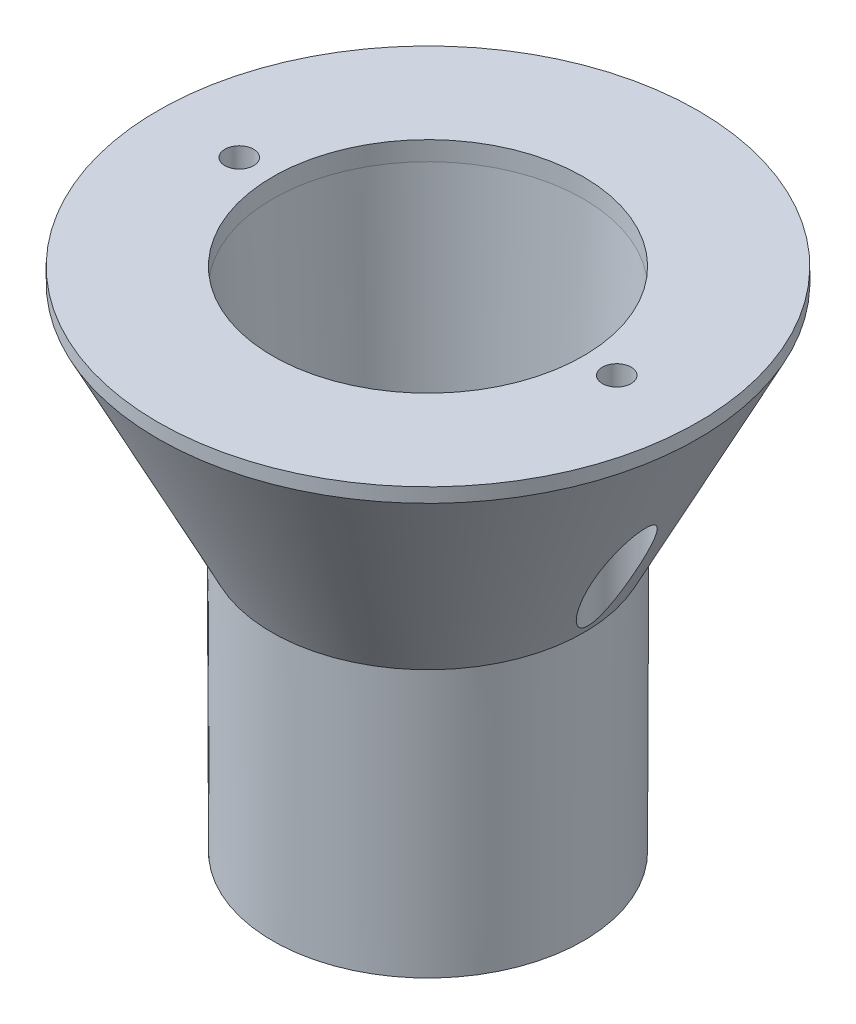
ISO-10303-21;
HEADER;
FILE_DESCRIPTION(('STEP AP214'),'2;1');
FILE_NAME('part.step','',(''),(''),'','','');
FILE_SCHEMA(('AUTOMOTIVE_DESIGN { 1 0 10303 214 1 1 1 1 }'));
ENDSEC;
DATA;
#1=APPLICATION_CONTEXT('core data for automotive mechanical design processes');
#2=APPLICATION_PROTOCOL_DEFINITION('international standard','automotive_design',2000,#1);
#3=PRODUCT_CONTEXT('',#1,'mechanical');
#4=PRODUCT('Part','Part','',(#3));
#5=PRODUCT_RELATED_PRODUCT_CATEGORY('part','',(#4));
#6=PRODUCT_DEFINITION_FORMATION('','',#4);
#7=PRODUCT_DEFINITION_CONTEXT('part definition',#1,'design');
#8=PRODUCT_DEFINITION('design','',#6,#7);
#9=PRODUCT_DEFINITION_SHAPE('','',#8);
#10=(LENGTH_UNIT() NAMED_UNIT(*) SI_UNIT(.MILLI.,.METRE.));
#11=(NAMED_UNIT(*) PLANE_ANGLE_UNIT() SI_UNIT($,.RADIAN.));
#12=(NAMED_UNIT(*) SI_UNIT($,.STERADIAN.) SOLID_ANGLE_UNIT());
#13=UNCERTAINTY_MEASURE_WITH_UNIT(LENGTH_MEASURE(1.E-05),#10,'distance_accuracy_value','');
#14=(GEOMETRIC_REPRESENTATION_CONTEXT(3) GLOBAL_UNCERTAINTY_ASSIGNED_CONTEXT((#13)) GLOBAL_UNIT_ASSIGNED_CONTEXT((#10,
#11,#12)) REPRESENTATION_CONTEXT('',''));
#15=CARTESIAN_POINT('',(0.,0.,0.));
#16=DIRECTION('',(0.,0.,1.));
#17=DIRECTION('',(1.,0.,0.));
#18=AXIS2_PLACEMENT_3D('',#15,#16,#17);
#19=CARTESIAN_POINT('',(0.,56.,0.));
#20=DIRECTION('',(0.,1.,0.));
#21=DIRECTION('',(0.,0.,1.));
#22=AXIS2_PLACEMENT_3D('',#19,#20,#21);
#23=CONICAL_SURFACE('',#22,32.6792977828704,0.469091457883603);
#24=CARTESIAN_POINT('',(0.,56.,0.));
#25=DIRECTION('',(0.,-1.,0.));
#26=DIRECTION('',(0.,0.,-1.));
#27=AXIS2_PLACEMENT_3D('',#24,#25,#26);
#28=CIRCLE('',#27,32.6792977828704);
#29=CARTESIAN_POINT('',(0.,56.,-32.6792977828704));
#30=VERTEX_POINT('',#29);
#31=EDGE_CURVE('E106',#30,#30,#28,.T.);
#32=ORIENTED_EDGE('',*,*,#31,.F.);
#33=EDGE_LOOP('',(#32));
#34=FACE_BOUND('',#33,.T.);
#35=CARTESIAN_POINT('',(0.,103.,0.));
#36=DIRECTION('',(0.,-1.,0.));
#37=DIRECTION('',(0.,0.,-1.));
#38=AXIS2_PLACEMENT_3D('',#35,#36,#37);
#39=CIRCLE('',#38,56.5);
#40=CARTESIAN_POINT('',(0.,103.,-56.5));
#41=VERTEX_POINT('',#40);
#42=EDGE_CURVE('E110',#41,#41,#39,.T.);
#43=ORIENTED_EDGE('',*,*,#42,.T.);
#44=EDGE_LOOP('',(#43));
#45=FACE_BOUND('',#44,.T.);
#46=CARTESIAN_POINT('',(34.1734496423926,59.1679183107118,-2.76185830376439));
#47=CARTESIAN_POINT('',(34.2240932588127,59.2830414120235,-2.85953173416801));
#48=CARTESIAN_POINT('',(34.2760816398383,59.4009266020086,-2.95324120522817));
#49=CARTESIAN_POINT('',(34.3822580395693,59.641033943921,-3.1336349898897));
#50=CARTESIAN_POINT('',(34.4364467859739,59.7632575289212,-3.22031695049874));
#51=CARTESIAN_POINT('',(34.546712080419,60.0112755485579,-3.3874734305346));
#52=CARTESIAN_POINT('',(34.6027907905906,60.137074045221,-3.4679404681241));
#53=CARTESIAN_POINT('',(34.7165093477716,60.3914567340945,-3.62318427952235));
#54=CARTESIAN_POINT('',(34.7741494378359,60.5200413593816,-3.69796016042516));
#55=CARTESIAN_POINT('',(34.9497021614597,60.9105523345077,-3.91531423815694));
#56=CARTESIAN_POINT('',(35.0696686990702,61.1759335393563,-4.05006023881596));
#57=CARTESIAN_POINT('',(35.3137641389315,61.7127478064651,-4.30187189883405));
#58=CARTESIAN_POINT('',(35.4378906694022,61.9841773916821,-4.41894743012312));
#59=CARTESIAN_POINT('',(35.6922196896456,62.5370638625621,-4.64001764337247));
#60=CARTESIAN_POINT('',(35.8224943764523,62.8186124428977,-4.74369842887699));
#61=CARTESIAN_POINT('',(36.0861982566153,63.3851200677914,-4.93686766176311));
#62=CARTESIAN_POINT('',(36.2196280672289,63.6700797742149,-5.026353305216));
#63=CARTESIAN_POINT('',(36.4893587970105,64.2426993151563,-5.1924114798588));
#64=CARTESIAN_POINT('',(36.6256621135614,64.5303612835268,-5.26897270637688));
#65=CARTESIAN_POINT('',(36.9007456307136,65.1074714879367,-5.40996861848303));
#66=CARTESIAN_POINT('',(37.0395259430762,65.3969198041881,-5.47440275537808));
#67=CARTESIAN_POINT('',(37.3194208553526,65.9772510103609,-5.59179013947667));
#68=CARTESIAN_POINT('',(37.4605369465202,66.268134726431,-5.64473572164685));
#69=CARTESIAN_POINT('',(37.744820091369,66.8507114165739,-5.73949393126588));
#70=CARTESIAN_POINT('',(37.8879871682162,67.1424043997571,-5.78130643286203));
#71=CARTESIAN_POINT('',(38.1761236931264,67.726072564722,-5.8540085595437));
#72=CARTESIAN_POINT('',(38.3210921892494,68.0180475280526,-5.8849037192482));
#73=CARTESIAN_POINT('',(38.6127379142719,68.6020865493654,-5.93588060155616));
#74=CARTESIAN_POINT('',(38.7594151464887,68.8941506075194,-5.95596230316239));
#75=CARTESIAN_POINT('',(39.0693074508934,69.5077294782676,-5.98674831390028));
#76=CARTESIAN_POINT('',(39.2326878801016,69.8292198293786,-5.99629177130556));
#77=CARTESIAN_POINT('',(39.5610972616413,70.4714880648432,-6.00193624087375));
#78=CARTESIAN_POINT('',(39.7261262525605,70.792265932304,-5.99803693764435));
#79=CARTESIAN_POINT('',(40.0577126401319,71.4329084573555,-5.97633555589808));
#80=CARTESIAN_POINT('',(40.2242712002849,71.7527721260483,-5.95852184527054));
#81=CARTESIAN_POINT('',(40.5584758675941,72.3907832151539,-5.90831483902926));
#82=CARTESIAN_POINT('',(40.726121943659,72.7089306841594,-5.87592195842769));
#83=CARTESIAN_POINT('',(41.0620008956688,73.342631743249,-5.79568337445215));
#84=CARTESIAN_POINT('',(41.2302331624871,73.6581872827787,-5.74785063721191));
#85=CARTESIAN_POINT('',(41.5669829248043,74.2862394444796,-5.63552100693516));
#86=CARTESIAN_POINT('',(41.7355004505818,74.5987357144826,-5.57102221826052));
#87=CARTESIAN_POINT('',(42.0719440352812,75.2191661427094,-5.42390741154021));
#88=CARTESIAN_POINT('',(42.2398706014806,75.5271064095009,-5.34131855553817));
#89=CARTESIAN_POINT('',(42.5745070696976,76.137447321724,-5.15596739341774));
#90=CARTESIAN_POINT('',(42.7412173741426,76.4398498545752,-5.05321210597725));
#91=CARTESIAN_POINT('',(43.0590657163501,77.0134062012582,-4.83397194569155));
#92=CARTESIAN_POINT('',(43.210383101018,77.2851253258676,-4.71924168260844));
#93=CARTESIAN_POINT('',(43.5097888267326,77.8202897711501,-4.46764818570193));
#94=CARTESIAN_POINT('',(43.6578752717393,78.08373027152,-4.33077233247022));
#95=CARTESIAN_POINT('',(43.947697123246,78.5970563454536,-4.03248812068441));
#96=CARTESIAN_POINT('',(44.0894719944825,78.8470291388389,-3.87127249853491));
#97=CARTESIAN_POINT('',(44.2957296492254,79.2092337198444,-3.6074041646605));
#98=CARTESIAN_POINT('',(44.363377536478,79.3277780257892,-3.51583313750674));
#99=CARTESIAN_POINT('',(44.496010491554,79.5597495401334,-3.32466886919148));
#100=CARTESIAN_POINT('',(44.5609965874268,79.6731787258607,-3.22507877012259));
#101=CARTESIAN_POINT('',(44.6680681929169,79.8597238420549,-3.04928576194942));
#102=CARTESIAN_POINT('',(44.711030840345,79.9344762346683,-2.97535235911406));
#103=CARTESIAN_POINT('',(44.7950537746641,80.0804942709334,-2.82311175338972));
#104=CARTESIAN_POINT('',(44.8361142140167,80.1517601940505,-2.74480490214503));
#105=CARTESIAN_POINT('',(44.9560390948315,80.3596673688453,-2.50282329546686));
#106=CARTESIAN_POINT('',(45.0315861913056,80.4903119848503,-2.33218542827915));
#107=CARTESIAN_POINT('',(45.1709972911084,80.7309470815283,-1.96922418584369));
#108=CARTESIAN_POINT('',(45.2347326311537,80.8407104132461,-1.77669512391471));
#109=CARTESIAN_POINT('',(45.3171141436117,80.9823909179104,-1.47381228809234));
#110=CARTESIAN_POINT('',(45.3423619976997,81.0257748166977,-1.37055675419671));
#111=CARTESIAN_POINT('',(45.3878318722238,81.103860745006,-1.15976966138343));
#112=CARTESIAN_POINT('',(45.4080556815771,81.1385658648188,-1.0522396403532));
#113=CARTESIAN_POINT('',(45.451932548179,81.2138296056048,-0.776408089294423));
#114=CARTESIAN_POINT('',(45.4718681508209,81.2479925625004,-0.605674893786222));
#115=CARTESIAN_POINT('',(45.4968628097814,81.290818659367,-0.260049792145964));
#116=CARTESIAN_POINT('',(45.5019323632831,81.299499792514,-0.0851609084308743));
#117=CARTESIAN_POINT('',(45.4967381074727,81.290602437304,0.263786023962667));
#118=CARTESIAN_POINT('',(45.4864681185147,81.2730133658051,0.437843709444193));
#119=CARTESIAN_POINT('',(45.4515569494015,81.2131786880742,0.780170090372294));
#120=CARTESIAN_POINT('',(45.4269047621219,81.1709141969909,0.948434247290684));
#121=CARTESIAN_POINT('',(45.3565285778207,81.0501275008486,1.32156071299554));
#122=CARTESIAN_POINT('',(45.3068316794702,80.9647570975946,1.5234345567045));
#123=CARTESIAN_POINT('',(45.1919013165517,80.7669453438762,1.90864066589916));
#124=CARTESIAN_POINT('',(45.1266373670203,80.6544508715816,2.09193553177921));
#125=CARTESIAN_POINT('',(45.0012249585994,80.4377897558674,2.3994517269744));
#126=CARTESIAN_POINT('',(44.9433641118133,80.3376790872041,2.52755177534445));
#127=CARTESIAN_POINT('',(44.8224136129272,80.128021076267,2.77320571692549));
#128=CARTESIAN_POINT('',(44.7593210189929,80.0184684233426,2.89075359818089));
#129=CARTESIAN_POINT('',(44.629007756502,79.7917434713867,3.11612789757386));
#130=CARTESIAN_POINT('',(44.5617808370199,79.6745596177179,3.22393895480164));
#131=CARTESIAN_POINT('',(44.4241554675018,79.4341588240777,3.43046380687181));
#132=CARTESIAN_POINT('',(44.353755827938,79.3109396197812,3.52917414667662));
#133=CARTESIAN_POINT('',(44.1513801457873,78.9559442254439,3.79626493337719));
#134=CARTESIAN_POINT('',(44.0165227009459,78.7184804529799,3.95493272981366));
#135=CARTESIAN_POINT('',(43.7415251578796,78.2321616369176,4.24851762035491));
#136=CARTESIAN_POINT('',(43.6013807692332,77.9832973049302,4.38341489813519));
#137=CARTESIAN_POINT('',(43.317454712078,77.4768475406289,4.63279520811406));
#138=CARTESIAN_POINT('',(43.1736663114077,77.2192456159198,4.74723674838517));
#139=CARTESIAN_POINT('',(42.8840391960473,76.6979603944611,4.95785433709485));
#140=CARTESIAN_POINT('',(42.7382009441589,76.4342784620703,5.05403443953239));
#141=CARTESIAN_POINT('',(42.4506547720288,75.9119063751729,5.2269239084802));
#142=CARTESIAN_POINT('',(42.3089894901036,75.6533833460025,5.30421409876563));
#143=CARTESIAN_POINT('',(42.025102410502,75.1328924163424,5.4450865108727));
#144=CARTESIAN_POINT('',(41.8828805195117,74.8709239191813,5.50866632432307));
#145=CARTESIAN_POINT('',(41.5982479612216,74.3441322419345,5.62324669835284));
#146=CARTESIAN_POINT('',(41.4558372313024,74.0793072508994,5.67423872175922));
#147=CARTESIAN_POINT('',(41.171248276035,73.5475130801397,5.76447845815755));
#148=CARTESIAN_POINT('',(41.0290700798823,73.2805436528333,5.80372479446551));
#149=CARTESIAN_POINT('',(40.7450881203682,72.7446695870867,5.87120759527475));
#150=CARTESIAN_POINT('',(40.6032848879541,72.4757632501781,5.8994327704618));
#151=CARTESIAN_POINT('',(40.3204180975521,71.9366586808549,5.94537059729547));
#152=CARTESIAN_POINT('',(40.1793546102573,71.6664603295228,5.96308226173961));
#153=CARTESIAN_POINT('',(39.7576895623939,70.8546679991084,6.00111231378163));
#154=CARTESIAN_POINT('',(39.4784507752968,70.3115699194124,6.00636321078794));
#155=CARTESIAN_POINT('',(39.050784475756,69.4710993698077,5.98506411144793));
#156=CARTESIAN_POINT('',(38.9005669310428,69.1741947559572,5.97187882445912));
#157=CARTESIAN_POINT('',(38.6017882253578,68.5802576077425,5.93429856045718));
#158=CARTESIAN_POINT('',(38.4532269828029,68.2832250804341,5.90990413808335));
#159=CARTESIAN_POINT('',(38.1578601928768,67.6892301898288,5.84990434348824));
#160=CARTESIAN_POINT('',(38.011055598657,67.3922679433387,5.81429314805829));
#161=CARTESIAN_POINT('',(37.7194553717181,66.7989360355354,5.7317209470842));
#162=CARTESIAN_POINT('',(37.5746597098846,66.5025663656876,5.68476010620657));
#163=CARTESIAN_POINT('',(37.2869813661722,65.9102477170466,5.57907518733444));
#164=CARTESIAN_POINT('',(37.1441030404883,65.6143007336465,5.52032799833567));
#165=CARTESIAN_POINT('',(36.8607774172104,65.0239279480638,5.390619749657));
#166=CARTESIAN_POINT('',(36.7203300327932,64.7295020918174,5.31965912718567));
#167=CARTESIAN_POINT('',(36.4422416212513,64.1430249739788,5.16482609183198));
#168=CARTESIAN_POINT('',(36.3045983504109,63.8509719361033,5.08096450131338));
#169=CARTESIAN_POINT('',(36.0323687807528,63.2698721073868,4.89921550700147));
#170=CARTESIAN_POINT('',(35.8977820060207,62.9808248523803,4.80133030435571));
#171=CARTESIAN_POINT('',(35.6164343050463,62.3729468895874,4.5775533249458));
#172=CARTESIAN_POINT('',(35.4701062276178,62.0546174290757,4.44972088213857));
#173=CARTESIAN_POINT('',(35.2545678175657,61.5826041511079,4.24102340144139));
#174=CARTESIAN_POINT('',(35.1833407677819,61.4260913554812,4.16858618039817));
#175=CARTESIAN_POINT('',(35.0424106168913,61.1153868088962,4.01753385504795));
#176=CARTESIAN_POINT('',(34.9727073384072,60.9611947884419,3.9389194747516));
#177=CARTESIAN_POINT('',(34.8355023613716,60.6566850653201,3.77541728101287));
#178=CARTESIAN_POINT('',(34.7679891293839,60.5063484524378,3.69057452123862));
#179=CARTESIAN_POINT('',(34.6349958959014,60.2092537036701,3.5134037948048));
#180=CARTESIAN_POINT('',(34.5695154593115,60.0624948034829,3.42107744540765));
#181=CARTESIAN_POINT('',(34.4410982398523,59.7737780063675,3.22814516794612));
#182=CARTESIAN_POINT('',(34.3781570856364,59.6318119340121,3.12755446064515));
#183=CARTESIAN_POINT('',(34.2552870573143,59.3538382297677,2.9168247191173));
#184=CARTESIAN_POINT('',(34.195356568123,59.2178274082965,2.80669089264819));
#185=CARTESIAN_POINT('',(34.098166187072,58.9966259064662,2.61300694725936));
#186=CARTESIAN_POINT('',(34.0598658989341,58.9092787987043,2.53244279416726));
#187=CARTESIAN_POINT('',(33.9853484221525,58.7390202698571,2.36578859469671));
#188=CARTESIAN_POINT('',(33.9491315413499,58.656109504405,2.27969773565667));
#189=CARTESIAN_POINT('',(33.8792964361726,58.4959588159611,2.10162381988006));
#190=CARTESIAN_POINT('',(33.8456742155967,58.4187101819606,2.00965023994202));
#191=CARTESIAN_POINT('',(33.7815781316679,58.2712125533653,1.81926747062083));
#192=CARTESIAN_POINT('',(33.7511027624096,58.2009602113174,1.72086139663068));
#193=CARTESIAN_POINT('',(33.6850583556676,58.0484998182357,1.48518539043335));
#194=CARTESIAN_POINT('',(33.6508933440251,57.9694612703767,1.34541251021093));
#195=CARTESIAN_POINT('',(33.5914986805953,57.8318682629872,1.05430726291086));
#196=CARTESIAN_POINT('',(33.5662561283145,57.7732842309086,0.902991972699741));
#197=CARTESIAN_POINT('',(33.5302172888338,57.6895791195249,0.615782695499019));
#198=CARTESIAN_POINT('',(33.5177684286042,57.6606328811779,0.481230670490452));
#199=CARTESIAN_POINT('',(33.502084205274,57.6241572586507,0.208746994289837));
#200=CARTESIAN_POINT('',(33.4988409238846,57.6166094683455,0.0708183506185858));
#201=CARTESIAN_POINT('',(33.5019026939807,57.6237323647655,-0.204408339856784));
#202=CARTESIAN_POINT('',(33.5082124038788,57.6384138913759,-0.341706046238674));
#203=CARTESIAN_POINT('',(33.5297276488202,57.6884345223501,-0.611772822899576));
#204=CARTESIAN_POINT('',(33.5449422896888,57.7237947719159,-0.744537110200622));
#205=CARTESIAN_POINT('',(33.5893905768896,57.8269693245925,-1.04652082091904));
#206=CARTESIAN_POINT('',(33.6216237000068,57.90171164816,-1.21290547014996));
#207=CARTESIAN_POINT('',(33.6962199485723,58.074294122076,-1.53067316206173));
#208=CARTESIAN_POINT('',(33.7386057721708,58.1721860210437,-1.68202150023009));
#209=CARTESIAN_POINT('',(33.8407895140255,58.4075647207719,-2.00184891042446));
#210=CARTESIAN_POINT('',(33.9023671642969,58.5490259677174,-2.16679357552731));
#211=CARTESIAN_POINT('',(34.0002508145161,58.7730921652754,-2.39996493834387));
#212=CARTESIAN_POINT('',(34.0338036371518,58.8497722615631,-2.47532461910033));
#213=CARTESIAN_POINT('',(34.1024967226708,59.0064806540563,-2.62173631157113));
#214=CARTESIAN_POINT('',(34.1376369491582,59.0865088734933,-2.69278842196169));
#215=CARTESIAN_POINT('',(34.1734496423926,59.1679183107118,-2.76185830376439));
#216=B_SPLINE_CURVE_WITH_KNOTS('',3,(#46,#47,#48,#49,#50,#51,#52,#53,#54,#55,#56,#57,#58,#59,
#60,#61,#62,#63,#64,#65,#66,#67,#68,#69,#70,#71,#72,#73,#74,#75,#76,#77,#78,#79,#80,#81,#82,#83,
#84,#85,#86,#87,#88,#89,#90,#91,#92,#93,#94,#95,#96,#97,#98,#99,#100,#101,#102,#103,#104,#105,
#106,#107,#108,#109,#110,#111,#112,#113,#114,#115,#116,#117,#118,#119,#120,#121,#122,#123,#124,
#125,#126,#127,#128,#129,#130,#131,#132,#133,#134,#135,#136,#137,#138,#139,#140,#141,#142,#143,
#144,#145,#146,#147,#148,#149,#150,#151,#152,#153,#154,#155,#156,#157,#158,#159,#160,#161,#162,
#163,#164,#165,#166,#167,#168,#169,#170,#171,#172,#173,#174,#175,#176,#177,#178,#179,#180,#181,
#182,#183,#184,#185,#186,#187,#188,#189,#190,#191,#192,#193,#194,#195,#196,#197,#198,#199,#200,
#201,#202,#203,#204,#205,#206,#207,#208,#209,#210,#211,#212,#213,#214,#215),.UNSPECIFIED.,.T.,
.F.,(4,2,2,2,2,2,2,2,2,2,2,2,2,2,2,2,2,2,2,2,2,2,2,2,2,2,2,2,2,2,2,2,2,2,2,2,2,2,2,2,2,2,2,2,2,
2,2,2,2,2,2,2,2,2,2,2,2,2,2,2,2,2,2,2,2,2,2,2,2,2,2,2,2,2,2,2,2,2,2,2,2,2,2,2,4),(0.,
0.477664479214762,0.955488237950174,1.43387853812145,1.91234374059605,2.8742521892733,
3.83562124514196,4.81651199849829,5.79759626398549,6.77953426289796,7.76151667915115,
8.74415226205556,9.72679895258672,10.7089467667477,11.6910964880049,12.7730920263382,
13.8551129504818,14.9380393875003,16.0209349997723,17.1029235700641,18.1850352626417,
19.2655331798461,20.3456557078292,21.3394182369407,22.3337490576102,23.3205833827031,
23.8134316220438,24.3060876809456,24.6466786009805,24.9872421753371,25.6688367895932,
26.357467921286,26.7014491791759,27.0453077791567,27.5685994533923,28.0915215329331,
28.614654332248,29.1381880268618,29.8087103247614,30.4805566460471,30.9975627658148,
31.5148615978074,32.0329627678376,32.5512598291001,33.4971840162456,34.4438930815757,
35.3925011603275,36.3408984033161,37.254810198302,38.1688824009259,39.0835728442805,
39.9983704543729,40.9141026768958,41.8299208716694,43.6605114741247,44.659377521478,
45.6581941492547,46.6575301715897,47.6568516959135,48.6581522134994,49.6594168946318,
50.6598461695862,51.6601185887512,52.7781885127775,53.3378682524732,53.8974824909638,
54.4533860922051,55.0091698769885,55.5639520645227,56.1184333869312,56.4927972053783,
56.8672161979295,57.2410465116366,57.6146970939988,58.1056390517623,58.5958682517455,
59.0086247003957,59.4210260038925,59.8336284751914,60.2466535961802,60.7991965887121,
61.3529866116728,62.0283627643796,62.3661515065291,62.7039325078145),.UNSPECIFIED.);
#217=CARTESIAN_POINT('',(34.1734496423926,59.1679183107118,-2.76185830376439));
#218=VERTEX_POINT('',#217);
#219=EDGE_CURVE('E63',#218,#218,#216,.T.);
#220=ORIENTED_EDGE('',*,*,#219,.F.);
#221=EDGE_LOOP('',(#220));
#222=FACE_BOUND('',#221,.T.);
#223=CARTESIAN_POINT('',(-34.1734496423926,59.1679183107118,-2.76185830376439));
#224=CARTESIAN_POINT('',(-34.2240932588127,59.2830414120235,-2.85953173416801));
#225=CARTESIAN_POINT('',(-34.2760816398383,59.4009266020086,-2.95324120522817));
#226=CARTESIAN_POINT('',(-34.3822580395693,59.641033943921,-3.1336349898897));
#227=CARTESIAN_POINT('',(-34.4364467859739,59.7632575289212,-3.22031695049874));
#228=CARTESIAN_POINT('',(-34.546712080419,60.0112755485579,-3.3874734305346));
#229=CARTESIAN_POINT('',(-34.6027907905906,60.137074045221,-3.4679404681241));
#230=CARTESIAN_POINT('',(-34.7165093477716,60.3914567340945,-3.62318427952235));
#231=CARTESIAN_POINT('',(-34.7741494378359,60.5200413593816,-3.69796016042516));
#232=CARTESIAN_POINT('',(-34.9497021614597,60.9105523345077,-3.91531423815694));
#233=CARTESIAN_POINT('',(-35.0696686990702,61.1759335393563,-4.05006023881596));
#234=CARTESIAN_POINT('',(-35.3137641389315,61.7127478064651,-4.30187189883405));
#235=CARTESIAN_POINT('',(-35.4378906694022,61.9841773916821,-4.41894743012312));
#236=CARTESIAN_POINT('',(-35.6922196896456,62.5370638625621,-4.64001764337247));
#237=CARTESIAN_POINT('',(-35.8224943764523,62.8186124428977,-4.74369842887699));
#238=CARTESIAN_POINT('',(-36.0861982566153,63.3851200677914,-4.93686766176311));
#239=CARTESIAN_POINT('',(-36.2196280672289,63.6700797742149,-5.026353305216));
#240=CARTESIAN_POINT('',(-36.4893587970105,64.2426993151563,-5.1924114798588));
#241=CARTESIAN_POINT('',(-36.6256621135614,64.5303612835268,-5.26897270637688));
#242=CARTESIAN_POINT('',(-36.9007456307136,65.1074714879367,-5.40996861848303));
#243=CARTESIAN_POINT('',(-37.0395259430762,65.3969198041881,-5.47440275537808));
#244=CARTESIAN_POINT('',(-37.3194208553526,65.9772510103609,-5.59179013947667));
#245=CARTESIAN_POINT('',(-37.4605369465202,66.268134726431,-5.64473572164685));
#246=CARTESIAN_POINT('',(-37.744820091369,66.8507114165739,-5.73949393126588));
#247=CARTESIAN_POINT('',(-37.8879871682162,67.1424043997571,-5.78130643286203));
#248=CARTESIAN_POINT('',(-38.1761236931264,67.726072564722,-5.8540085595437));
#249=CARTESIAN_POINT('',(-38.3210921892494,68.0180475280526,-5.8849037192482));
#250=CARTESIAN_POINT('',(-38.6127379142719,68.6020865493654,-5.93588060155616));
#251=CARTESIAN_POINT('',(-38.7594151464887,68.8941506075194,-5.95596230316239));
#252=CARTESIAN_POINT('',(-39.0693074508934,69.5077294782676,-5.98674831390028));
#253=CARTESIAN_POINT('',(-39.2326878801016,69.8292198293786,-5.99629177130556));
#254=CARTESIAN_POINT('',(-39.5610972616413,70.4714880648432,-6.00193624087375));
#255=CARTESIAN_POINT('',(-39.7261262525605,70.792265932304,-5.99803693764435));
#256=CARTESIAN_POINT('',(-40.0577126401319,71.4329084573555,-5.97633555589808));
#257=CARTESIAN_POINT('',(-40.2242712002849,71.7527721260483,-5.95852184527054));
#258=CARTESIAN_POINT('',(-40.5584758675941,72.3907832151539,-5.90831483902926));
#259=CARTESIAN_POINT('',(-40.726121943659,72.7089306841594,-5.87592195842769));
#260=CARTESIAN_POINT('',(-41.0620008956688,73.342631743249,-5.79568337445215));
#261=CARTESIAN_POINT('',(-41.2302331624871,73.6581872827787,-5.74785063721191));
#262=CARTESIAN_POINT('',(-41.5669829248043,74.2862394444796,-5.63552100693516));
#263=CARTESIAN_POINT('',(-41.7355004505818,74.5987357144826,-5.57102221826052));
#264=CARTESIAN_POINT('',(-42.0719440352812,75.2191661427094,-5.42390741154021));
#265=CARTESIAN_POINT('',(-42.2398706014806,75.5271064095009,-5.34131855553817));
#266=CARTESIAN_POINT('',(-42.5745070696976,76.137447321724,-5.15596739341774));
#267=CARTESIAN_POINT('',(-42.7412173741426,76.4398498545752,-5.05321210597725));
#268=CARTESIAN_POINT('',(-43.0590657163501,77.0134062012582,-4.83397194569155));
#269=CARTESIAN_POINT('',(-43.210383101018,77.2851253258676,-4.71924168260844));
#270=CARTESIAN_POINT('',(-43.5097888267326,77.8202897711501,-4.46764818570193));
#271=CARTESIAN_POINT('',(-43.6578752717393,78.08373027152,-4.33077233247022));
#272=CARTESIAN_POINT('',(-43.947697123246,78.5970563454536,-4.03248812068441));
#273=CARTESIAN_POINT('',(-44.0894719944825,78.8470291388389,-3.87127249853491));
#274=CARTESIAN_POINT('',(-44.2957296492254,79.2092337198444,-3.6074041646605));
#275=CARTESIAN_POINT('',(-44.363377536478,79.3277780257892,-3.51583313750674));
#276=CARTESIAN_POINT('',(-44.496010491554,79.5597495401334,-3.32466886919148));
#277=CARTESIAN_POINT('',(-44.5609965874268,79.6731787258607,-3.22507877012259));
#278=CARTESIAN_POINT('',(-44.6680681929169,79.8597238420549,-3.04928576194942));
#279=CARTESIAN_POINT('',(-44.711030840345,79.9344762346683,-2.97535235911406));
#280=CARTESIAN_POINT('',(-44.7950537746641,80.0804942709334,-2.82311175338972));
#281=CARTESIAN_POINT('',(-44.8361142140167,80.1517601940505,-2.74480490214503));
#282=CARTESIAN_POINT('',(-44.9560390948315,80.3596673688453,-2.50282329546686));
#283=CARTESIAN_POINT('',(-45.0315861913056,80.4903119848503,-2.33218542827915));
#284=CARTESIAN_POINT('',(-45.1709972911084,80.7309470815283,-1.96922418584369));
#285=CARTESIAN_POINT('',(-45.2347326311537,80.8407104132461,-1.77669512391471));
#286=CARTESIAN_POINT('',(-45.3171141436117,80.9823909179104,-1.47381228809234));
#287=CARTESIAN_POINT('',(-45.3423619976997,81.0257748166977,-1.37055675419671));
#288=CARTESIAN_POINT('',(-45.3878318722238,81.103860745006,-1.15976966138343));
#289=CARTESIAN_POINT('',(-45.4080556815771,81.1385658648188,-1.0522396403532));
#290=CARTESIAN_POINT('',(-45.451932548179,81.2138296056048,-0.776408089294423));
#291=CARTESIAN_POINT('',(-45.4718681508209,81.2479925625004,-0.605674893786222));
#292=CARTESIAN_POINT('',(-45.4968628097814,81.290818659367,-0.260049792145964));
#293=CARTESIAN_POINT('',(-45.5019323632831,81.299499792514,-0.0851609084308743));
#294=CARTESIAN_POINT('',(-45.4967381074727,81.290602437304,0.263786023962667));
#295=CARTESIAN_POINT('',(-45.4864681185147,81.2730133658051,0.437843709444193));
#296=CARTESIAN_POINT('',(-45.4515569494015,81.2131786880742,0.780170090372294));
#297=CARTESIAN_POINT('',(-45.4269047621219,81.1709141969909,0.948434247290684));
#298=CARTESIAN_POINT('',(-45.3565285778207,81.0501275008486,1.32156071299554));
#299=CARTESIAN_POINT('',(-45.3068316794702,80.9647570975946,1.5234345567045));
#300=CARTESIAN_POINT('',(-45.1919013165517,80.7669453438762,1.90864066589916));
#301=CARTESIAN_POINT('',(-45.1266373670203,80.6544508715816,2.09193553177921));
#302=CARTESIAN_POINT('',(-45.0012249585994,80.4377897558674,2.3994517269744));
#303=CARTESIAN_POINT('',(-44.9433641118133,80.3376790872041,2.52755177534445));
#304=CARTESIAN_POINT('',(-44.8224136129272,80.128021076267,2.77320571692549));
#305=CARTESIAN_POINT('',(-44.7593210189929,80.0184684233426,2.89075359818089));
#306=CARTESIAN_POINT('',(-44.629007756502,79.7917434713867,3.11612789757386));
#307=CARTESIAN_POINT('',(-44.5617808370199,79.6745596177179,3.22393895480164));
#308=CARTESIAN_POINT('',(-44.4241554675018,79.4341588240777,3.43046380687181));
#309=CARTESIAN_POINT('',(-44.353755827938,79.3109396197812,3.52917414667662));
#310=CARTESIAN_POINT('',(-44.1513801457873,78.9559442254439,3.79626493337719));
#311=CARTESIAN_POINT('',(-44.0165227009459,78.7184804529799,3.95493272981366));
#312=CARTESIAN_POINT('',(-43.7415251578796,78.2321616369176,4.24851762035491));
#313=CARTESIAN_POINT('',(-43.6013807692332,77.9832973049302,4.38341489813519));
#314=CARTESIAN_POINT('',(-43.317454712078,77.4768475406289,4.63279520811406));
#315=CARTESIAN_POINT('',(-43.1736663114077,77.2192456159198,4.74723674838517));
#316=CARTESIAN_POINT('',(-42.8840391960473,76.6979603944611,4.95785433709485));
#317=CARTESIAN_POINT('',(-42.7382009441589,76.4342784620703,5.05403443953239));
#318=CARTESIAN_POINT('',(-42.4506547720288,75.9119063751729,5.2269239084802));
#319=CARTESIAN_POINT('',(-42.3089894901036,75.6533833460025,5.30421409876563));
#320=CARTESIAN_POINT('',(-42.025102410502,75.1328924163424,5.4450865108727));
#321=CARTESIAN_POINT('',(-41.8828805195117,74.8709239191813,5.50866632432307));
#322=CARTESIAN_POINT('',(-41.5982479612216,74.3441322419345,5.62324669835284));
#323=CARTESIAN_POINT('',(-41.4558372313024,74.0793072508994,5.67423872175922));
#324=CARTESIAN_POINT('',(-41.171248276035,73.5475130801397,5.76447845815755));
#325=CARTESIAN_POINT('',(-41.0290700798823,73.2805436528333,5.80372479446551));
#326=CARTESIAN_POINT('',(-40.7450881203682,72.7446695870867,5.87120759527475));
#327=CARTESIAN_POINT('',(-40.6032848879541,72.4757632501781,5.8994327704618));
#328=CARTESIAN_POINT('',(-40.3204180975521,71.9366586808549,5.94537059729547));
#329=CARTESIAN_POINT('',(-40.1793546102573,71.6664603295228,5.96308226173961));
#330=CARTESIAN_POINT('',(-39.7576895623939,70.8546679991084,6.00111231378163));
#331=CARTESIAN_POINT('',(-39.4784507752968,70.3115699194124,6.00636321078794));
#332=CARTESIAN_POINT('',(-39.050784475756,69.4710993698077,5.98506411144793));
#333=CARTESIAN_POINT('',(-38.9005669310428,69.1741947559572,5.97187882445912));
#334=CARTESIAN_POINT('',(-38.6017882253578,68.5802576077425,5.93429856045718));
#335=CARTESIAN_POINT('',(-38.4532269828029,68.2832250804341,5.90990413808335));
#336=CARTESIAN_POINT('',(-38.1578601928768,67.6892301898288,5.84990434348824));
#337=CARTESIAN_POINT('',(-38.011055598657,67.3922679433387,5.81429314805829));
#338=CARTESIAN_POINT('',(-37.7194553717181,66.7989360355354,5.7317209470842));
#339=CARTESIAN_POINT('',(-37.5746597098846,66.5025663656876,5.68476010620657));
#340=CARTESIAN_POINT('',(-37.2869813661722,65.9102477170466,5.57907518733444));
#341=CARTESIAN_POINT('',(-37.1441030404883,65.6143007336465,5.52032799833567));
#342=CARTESIAN_POINT('',(-36.8607774172104,65.0239279480638,5.390619749657));
#343=CARTESIAN_POINT('',(-36.7203300327932,64.7295020918174,5.31965912718567));
#344=CARTESIAN_POINT('',(-36.4422416212513,64.1430249739788,5.16482609183198));
#345=CARTESIAN_POINT('',(-36.3045983504109,63.8509719361033,5.08096450131338));
#346=CARTESIAN_POINT('',(-36.0323687807528,63.2698721073868,4.89921550700147));
#347=CARTESIAN_POINT('',(-35.8977820060207,62.9808248523803,4.80133030435571));
#348=CARTESIAN_POINT('',(-35.6164343050463,62.3729468895874,4.5775533249458));
#349=CARTESIAN_POINT('',(-35.4701062276178,62.0546174290757,4.44972088213857));
#350=CARTESIAN_POINT('',(-35.2545678175657,61.5826041511079,4.24102340144139));
#351=CARTESIAN_POINT('',(-35.1833407677819,61.4260913554812,4.16858618039817));
#352=CARTESIAN_POINT('',(-35.0424106168913,61.1153868088962,4.01753385504795));
#353=CARTESIAN_POINT('',(-34.9727073384072,60.9611947884419,3.9389194747516));
#354=CARTESIAN_POINT('',(-34.8355023613716,60.6566850653201,3.77541728101287));
#355=CARTESIAN_POINT('',(-34.7679891293839,60.5063484524378,3.69057452123862));
#356=CARTESIAN_POINT('',(-34.6349958959014,60.2092537036701,3.5134037948048));
#357=CARTESIAN_POINT('',(-34.5695154593115,60.0624948034829,3.42107744540765));
#358=CARTESIAN_POINT('',(-34.4410982398523,59.7737780063675,3.22814516794612));
#359=CARTESIAN_POINT('',(-34.3781570856364,59.6318119340121,3.12755446064515));
#360=CARTESIAN_POINT('',(-34.2552870573143,59.3538382297677,2.9168247191173));
#361=CARTESIAN_POINT('',(-34.195356568123,59.2178274082965,2.80669089264819));
#362=CARTESIAN_POINT('',(-34.098166187072,58.9966259064662,2.61300694725936));
#363=CARTESIAN_POINT('',(-34.0598658989341,58.9092787987043,2.53244279416726));
#364=CARTESIAN_POINT('',(-33.9853484221525,58.7390202698571,2.36578859469671));
#365=CARTESIAN_POINT('',(-33.9491315413499,58.656109504405,2.27969773565667));
#366=CARTESIAN_POINT('',(-33.8792964361726,58.4959588159611,2.10162381988006));
#367=CARTESIAN_POINT('',(-33.8456742155967,58.4187101819606,2.00965023994202));
#368=CARTESIAN_POINT('',(-33.7815781316679,58.2712125533653,1.81926747062083));
#369=CARTESIAN_POINT('',(-33.7511027624096,58.2009602113174,1.72086139663068));
#370=CARTESIAN_POINT('',(-33.6850583556676,58.0484998182357,1.48518539043335));
#371=CARTESIAN_POINT('',(-33.6508933440251,57.9694612703767,1.34541251021093));
#372=CARTESIAN_POINT('',(-33.5914986805953,57.8318682629872,1.05430726291086));
#373=CARTESIAN_POINT('',(-33.5662561283145,57.7732842309086,0.902991972699741));
#374=CARTESIAN_POINT('',(-33.5302172888338,57.6895791195249,0.615782695499019));
#375=CARTESIAN_POINT('',(-33.5177684286042,57.6606328811779,0.481230670490452));
#376=CARTESIAN_POINT('',(-33.502084205274,57.6241572586507,0.208746994289837));
#377=CARTESIAN_POINT('',(-33.4988409238846,57.6166094683455,0.0708183506185858));
#378=CARTESIAN_POINT('',(-33.5019026939807,57.6237323647655,-0.204408339856784));
#379=CARTESIAN_POINT('',(-33.5082124038788,57.6384138913759,-0.341706046238674));
#380=CARTESIAN_POINT('',(-33.5297276488202,57.6884345223501,-0.611772822899576));
#381=CARTESIAN_POINT('',(-33.5449422896888,57.7237947719159,-0.744537110200622));
#382=CARTESIAN_POINT('',(-33.5893905768896,57.8269693245925,-1.04652082091904));
#383=CARTESIAN_POINT('',(-33.6216237000068,57.90171164816,-1.21290547014996));
#384=CARTESIAN_POINT('',(-33.6962199485723,58.074294122076,-1.53067316206173));
#385=CARTESIAN_POINT('',(-33.7386057721708,58.1721860210437,-1.68202150023009));
#386=CARTESIAN_POINT('',(-33.8407895140255,58.4075647207719,-2.00184891042446));
#387=CARTESIAN_POINT('',(-33.9023671642969,58.5490259677174,-2.16679357552731));
#388=CARTESIAN_POINT('',(-34.0002508145161,58.7730921652754,-2.39996493834387));
#389=CARTESIAN_POINT('',(-34.0338036371518,58.8497722615631,-2.47532461910033));
#390=CARTESIAN_POINT('',(-34.1024967226708,59.0064806540563,-2.62173631157113));
#391=CARTESIAN_POINT('',(-34.1376369491582,59.0865088734933,-2.69278842196169));
#392=CARTESIAN_POINT('',(-34.1734496423926,59.1679183107118,-2.76185830376439));
#393=B_SPLINE_CURVE_WITH_KNOTS('',3,(#223,#224,#225,#226,#227,#228,#229,#230,#231,#232,#233,
#234,#235,#236,#237,#238,#239,#240,#241,#242,#243,#244,#245,#246,#247,#248,#249,#250,#251,#252,
#253,#254,#255,#256,#257,#258,#259,#260,#261,#262,#263,#264,#265,#266,#267,#268,#269,#270,#271,
#272,#273,#274,#275,#276,#277,#278,#279,#280,#281,#282,#283,#284,#285,#286,#287,#288,#289,#290,
#291,#292,#293,#294,#295,#296,#297,#298,#299,#300,#301,#302,#303,#304,#305,#306,#307,#308,#309,
#310,#311,#312,#313,#314,#315,#316,#317,#318,#319,#320,#321,#322,#323,#324,#325,#326,#327,#328,
#329,#330,#331,#332,#333,#334,#335,#336,#337,#338,#339,#340,#341,#342,#343,#344,#345,#346,#347,
#348,#349,#350,#351,#352,#353,#354,#355,#356,#357,#358,#359,#360,#361,#362,#363,#364,#365,#366,
#367,#368,#369,#370,#371,#372,#373,#374,#375,#376,#377,#378,#379,#380,#381,#382,#383,#384,#385,
#386,#387,#388,#389,#390,#391,#392),.UNSPECIFIED.,.T.,.F.,(4,2,2,2,2,2,2,2,2,2,2,2,2,2,2,2,2,2,
2,2,2,2,2,2,2,2,2,2,2,2,2,2,2,2,2,2,2,2,2,2,2,2,2,2,2,2,2,2,2,2,2,2,2,2,2,2,2,2,2,2,2,2,2,2,2,2,
2,2,2,2,2,2,2,2,2,2,2,2,2,2,2,2,2,2,4),(0.,0.477664479214762,0.955488237950174,1.43387853812145,
1.91234374059605,2.8742521892733,3.83562124514196,4.81651199849829,5.79759626398549,
6.77953426289796,7.76151667915115,8.74415226205556,9.72679895258672,10.7089467667477,
11.6910964880049,12.7730920263382,13.8551129504818,14.9380393875003,16.0209349997723,
17.1029235700641,18.1850352626417,19.2655331798461,20.3456557078292,21.3394182369407,
22.3337490576102,23.3205833827031,23.8134316220438,24.3060876809456,24.6466786009805,
24.9872421753371,25.6688367895932,26.357467921286,26.7014491791759,27.0453077791567,
27.5685994533923,28.0915215329331,28.614654332248,29.1381880268618,29.8087103247614,
30.4805566460471,30.9975627658148,31.5148615978074,32.0329627678376,32.5512598291001,
33.4971840162456,34.4438930815757,35.3925011603275,36.3408984033161,37.254810198302,
38.1688824009259,39.0835728442805,39.9983704543729,40.9141026768958,41.8299208716694,
43.6605114741247,44.659377521478,45.6581941492547,46.6575301715897,47.6568516959135,
48.6581522134994,49.6594168946318,50.6598461695862,51.6601185887512,52.7781885127775,
53.3378682524732,53.8974824909638,54.4533860922051,55.0091698769885,55.5639520645227,
56.1184333869312,56.4927972053783,56.8672161979295,57.2410465116366,57.6146970939988,
58.1056390517623,58.5958682517455,59.0086247003957,59.4210260038925,59.8336284751914,
60.2466535961802,60.7991965887121,61.3529866116728,62.0283627643796,62.3661515065291,
62.7039325078145),.UNSPECIFIED.);
#394=CARTESIAN_POINT('',(-34.1734496423926,59.1679183107118,-2.76185830376439));
#395=VERTEX_POINT('',#394);
#396=EDGE_CURVE('E42',#395,#395,#393,.T.);
#397=ORIENTED_EDGE('',*,*,#396,.T.);
#398=EDGE_LOOP('',(#397));
#399=FACE_BOUND('',#398,.T.);
#400=ADVANCED_FACE('F38',(#34,#45,#222,#399),#23,.T.);
#401=CARTESIAN_POINT('',(0.,0.,0.));
#402=DIRECTION('',(0.,1.,0.));
#403=DIRECTION('',(0.,0.,1.));
#404=AXIS2_PLACEMENT_3D('',#401,#402,#403);
#405=CONICAL_SURFACE('',#404,32.5000128121087,0.00320150639688512);
#406=ORIENTED_EDGE('',*,*,#31,.T.);
#407=EDGE_LOOP('',(#406));
#408=FACE_BOUND('',#407,.T.);
#409=CARTESIAN_POINT('',(0.,0.,0.));
#410=DIRECTION('',(0.,-1.,0.));
#411=DIRECTION('',(0.,0.,-1.));
#412=AXIS2_PLACEMENT_3D('',#409,#410,#411);
#413=CIRCLE('',#412,32.5000128121087);
#414=CARTESIAN_POINT('',(0.,0.,-32.5000128121087));
#415=VERTEX_POINT('',#414);
#416=EDGE_CURVE('E10',#415,#415,#413,.T.);
#417=ORIENTED_EDGE('',*,*,#416,.F.);
#418=EDGE_LOOP('',(#417));
#419=FACE_BOUND('',#418,.T.);
#420=ADVANCED_FACE('F40',(#408,#419),#405,.T.);
#421=CARTESIAN_POINT('',(30.,0.,0.));
#422=DIRECTION('',(0.,-1.,0.));
#423=DIRECTION('',(0.,0.,-1.));
#424=AXIS2_PLACEMENT_3D('',#421,#422,#423);
#425=PLANE('',#424);
#426=ORIENTED_EDGE('',*,*,#416,.T.);
#427=EDGE_LOOP('',(#426));
#428=FACE_BOUND('',#427,.T.);
#429=CARTESIAN_POINT('',(0.,0.,0.));
#430=DIRECTION('',(0.,-1.,0.));
#431=DIRECTION('',(0.,0.,-1.));
#432=AXIS2_PLACEMENT_3D('',#429,#430,#431);
#433=CIRCLE('',#432,30.);
#434=CARTESIAN_POINT('',(0.,0.,-30.));
#435=VERTEX_POINT('',#434);
#436=EDGE_CURVE('E51',#435,#435,#433,.T.);
#437=ORIENTED_EDGE('',*,*,#436,.F.);
#438=EDGE_LOOP('',(#437));
#439=FACE_BOUND('',#438,.T.);
#440=ADVANCED_FACE('F101',(#428,#439),#425,.T.);
#441=CARTESIAN_POINT('',(0.,49.9240444098049,0.));
#442=DIRECTION('',(0.,1.,0.));
#443=DIRECTION('',(0.,0.,1.));
#444=AXIS2_PLACEMENT_3D('',#441,#442,#443);
#445=CONICAL_SURFACE('',#444,30.1598326936128,0.0032015063968853);
#446=ORIENTED_EDGE('',*,*,#436,.T.);
#447=EDGE_LOOP('',(#446));
#448=FACE_BOUND('',#447,.T.);
#449=CARTESIAN_POINT('',(0.,49.9240444098049,0.));
#450=DIRECTION('',(0.,-1.,0.));
#451=DIRECTION('',(0.,0.,-1.));
#452=AXIS2_PLACEMENT_3D('',#449,#450,#451);
#453=CIRCLE('',#452,30.1598326936128);
#454=CARTESIAN_POINT('',(0.,49.9240444098049,-30.1598326936128));
#455=VERTEX_POINT('',#454);
#456=EDGE_CURVE('E56',#455,#455,#453,.T.);
#457=ORIENTED_EDGE('',*,*,#456,.F.);
#458=EDGE_LOOP('',(#457));
#459=FACE_BOUND('',#458,.T.);
#460=ADVANCED_FACE('F146',(#448,#459),#445,.F.);
#461=CARTESIAN_POINT('',(0.,102.,0.));
#462=DIRECTION('',(0.,1.,0.));
#463=DIRECTION('',(0.,0.,1.));
#464=AXIS2_PLACEMENT_3D('',#461,#462,#463);
#465=CONICAL_SURFACE('',#464,32.5,0.0449073656376893);
#466=ORIENTED_EDGE('',*,*,#456,.T.);
#467=EDGE_LOOP('',(#466));
#468=FACE_BOUND('',#467,.T.);
#469=CARTESIAN_POINT('',(0.,102.,0.));
#470=DIRECTION('',(0.,-1.,0.));
#471=DIRECTION('',(0.,0.,-1.));
#472=AXIS2_PLACEMENT_3D('',#469,#470,#471);
#473=CIRCLE('',#472,32.5);
#474=CARTESIAN_POINT('',(0.,102.,-32.5));
#475=VERTEX_POINT('',#474);
#476=EDGE_CURVE('E138',#475,#475,#473,.T.);
#477=ORIENTED_EDGE('',*,*,#476,.F.);
#478=EDGE_LOOP('',(#477));
#479=FACE_BOUND('',#478,.T.);
#480=ADVANCED_FACE('F143',(#468,#479),#465,.F.);
#481=CARTESIAN_POINT('',(0.,0.,0.));
#482=DIRECTION('',(0.,-1.,0.));
#483=DIRECTION('',(0.,0.,-1.));
#484=AXIS2_PLACEMENT_3D('',#481,#482,#483);
#485=CYLINDRICAL_SURFACE('',#484,32.5);
#486=ORIENTED_EDGE('',*,*,#476,.T.);
#487=EDGE_LOOP('',(#486));
#488=FACE_BOUND('',#487,.T.);
#489=CARTESIAN_POINT('',(0.,106.,0.));
#490=DIRECTION('',(0.,-1.,0.));
#491=DIRECTION('',(0.,0.,-1.));
#492=AXIS2_PLACEMENT_3D('',#489,#490,#491);
#493=CIRCLE('',#492,32.5);
#494=CARTESIAN_POINT('',(0.,106.,-32.5));
#495=VERTEX_POINT('',#494);
#496=EDGE_CURVE('E135',#495,#495,#493,.T.);
#497=ORIENTED_EDGE('',*,*,#496,.F.);
#498=EDGE_LOOP('',(#497));
#499=FACE_BOUND('',#498,.T.);
#500=ADVANCED_FACE('F154',(#488,#499),#485,.F.);
#501=CARTESIAN_POINT('',(32.5,106.,0.));
#502=DIRECTION('',(0.,1.,0.));
#503=DIRECTION('',(0.,0.,1.));
#504=AXIS2_PLACEMENT_3D('',#501,#502,#503);
#505=PLANE('',#504);
#506=CARTESIAN_POINT('',(39.5,106.,0.));
#507=DIRECTION('',(0.,-1.,0.));
#508=DIRECTION('',(0.,0.,1.));
#509=AXIS2_PLACEMENT_3D('',#506,#507,#508);
#510=CIRCLE('',#509,3.);
#511=CARTESIAN_POINT('',(39.5,106.,3.));
#512=VERTEX_POINT('',#511);
#513=EDGE_CURVE('E70',#512,#512,#510,.T.);
#514=ORIENTED_EDGE('',*,*,#513,.T.);
#515=EDGE_LOOP('',(#514));
#516=FACE_BOUND('',#515,.T.);
#517=CARTESIAN_POINT('',(-39.5,106.,0.));
#518=DIRECTION('',(0.,1.,0.));
#519=DIRECTION('',(0.,0.,1.));
#520=AXIS2_PLACEMENT_3D('',#517,#518,#519);
#521=CIRCLE('',#520,3.);
#522=CARTESIAN_POINT('',(-39.5,106.,3.));
#523=VERTEX_POINT('',#522);
#524=EDGE_CURVE('E127',#523,#523,#521,.T.);
#525=ORIENTED_EDGE('',*,*,#524,.F.);
#526=EDGE_LOOP('',(#525));
#527=FACE_BOUND('',#526,.T.);
#528=ORIENTED_EDGE('',*,*,#496,.T.);
#529=EDGE_LOOP('',(#528));
#530=FACE_BOUND('',#529,.T.);
#531=CARTESIAN_POINT('',(0.,106.,0.));
#532=DIRECTION('',(0.,-1.,0.));
#533=DIRECTION('',(0.,0.,-1.));
#534=AXIS2_PLACEMENT_3D('',#531,#532,#533);
#535=CIRCLE('',#534,56.5);
#536=CARTESIAN_POINT('',(0.,106.,-56.5));
#537=VERTEX_POINT('',#536);
#538=EDGE_CURVE('E132',#537,#537,#535,.T.);
#539=ORIENTED_EDGE('',*,*,#538,.F.);
#540=EDGE_LOOP('',(#539));
#541=FACE_BOUND('',#540,.T.);
#542=ADVANCED_FACE('F92',(#516,#527,#530,#541),#505,.T.);
#543=CARTESIAN_POINT('',(0.,0.,0.));
#544=DIRECTION('',(0.,-1.,0.));
#545=DIRECTION('',(0.,0.,-1.));
#546=AXIS2_PLACEMENT_3D('',#543,#544,#545);
#547=CYLINDRICAL_SURFACE('',#546,56.5);
#548=ORIENTED_EDGE('',*,*,#538,.T.);
#549=EDGE_LOOP('',(#548));
#550=FACE_BOUND('',#549,.T.);
#551=ORIENTED_EDGE('',*,*,#42,.F.);
#552=EDGE_LOOP('',(#551));
#553=FACE_BOUND('',#552,.T.);
#554=ADVANCED_FACE('F87',(#550,#553),#547,.T.);
#555=CARTESIAN_POINT('',(-39.5,71.,0.));
#556=DIRECTION('',(0.,1.,0.));
#557=DIRECTION('',(0.,0.,1.));
#558=AXIS2_PLACEMENT_3D('',#555,#556,#557);
#559=CYLINDRICAL_SURFACE('',#558,3.);
#560=CARTESIAN_POINT('',(-39.5,98.,0.));
#561=DIRECTION('',(0.,1.,0.));
#562=DIRECTION('',(0.,0.,1.));
#563=AXIS2_PLACEMENT_3D('',#560,#561,#562);
#564=CIRCLE('',#563,3.);
#565=CARTESIAN_POINT('',(-39.5,98.,3.));
#566=VERTEX_POINT('',#565);
#567=EDGE_CURVE('E71',#566,#566,#564,.F.);
#568=ORIENTED_EDGE('',*,*,#567,.T.);
#569=EDGE_LOOP('',(#568));
#570=FACE_BOUND('',#569,.T.);
#571=ORIENTED_EDGE('',*,*,#524,.T.);
#572=EDGE_LOOP('',(#571));
#573=FACE_BOUND('',#572,.T.);
#574=ADVANCED_FACE('F84',(#570,#573),#559,.F.);
#575=CARTESIAN_POINT('',(39.5,71.,0.));
#576=DIRECTION('',(0.,1.,0.));
#577=DIRECTION('',(0.,0.,1.));
#578=AXIS2_PLACEMENT_3D('',#575,#576,#577);
#579=CYLINDRICAL_SURFACE('',#578,3.);
#580=CARTESIAN_POINT('',(39.5,98.,0.));
#581=DIRECTION('',(0.,1.,0.));
#582=DIRECTION('',(0.,0.,1.));
#583=AXIS2_PLACEMENT_3D('',#580,#581,#582);
#584=CIRCLE('',#583,3.);
#585=CARTESIAN_POINT('',(39.5,98.,3.));
#586=VERTEX_POINT('',#585);
#587=EDGE_CURVE('E60',#586,#586,#584,.T.);
#588=ORIENTED_EDGE('',*,*,#587,.F.);
#589=EDGE_LOOP('',(#588));
#590=FACE_BOUND('',#589,.T.);
#591=ORIENTED_EDGE('',*,*,#513,.F.);
#592=EDGE_LOOP('',(#591));
#593=FACE_BOUND('',#592,.T.);
#594=ADVANCED_FACE('F81',(#590,#593),#579,.F.);
#595=CARTESIAN_POINT('',(39.5,46.,0.));
#596=DIRECTION('',(0.,1.,0.));
#597=DIRECTION('',(0.,0.,1.));
#598=AXIS2_PLACEMENT_3D('',#595,#596,#597);
#599=CYLINDRICAL_SURFACE('',#598,5.99999999999999);
#600=ORIENTED_EDGE('',*,*,#219,.T.);
#601=EDGE_LOOP('',(#600));
#602=FACE_BOUND('',#601,.T.);
#603=CARTESIAN_POINT('',(39.5,98.,0.));
#604=DIRECTION('',(0.,1.,0.));
#605=DIRECTION('',(0.,0.,1.));
#606=AXIS2_PLACEMENT_3D('',#603,#604,#605);
#607=CIRCLE('',#606,5.99999999999999);
#608=CARTESIAN_POINT('',(39.5,98.,5.99999999999999));
#609=VERTEX_POINT('',#608);
#610=EDGE_CURVE('E64',#609,#609,#607,.T.);
#611=ORIENTED_EDGE('',*,*,#610,.T.);
#612=EDGE_LOOP('',(#611));
#613=FACE_BOUND('',#612,.T.);
#614=ADVANCED_FACE('F75',(#602,#613),#599,.F.);
#615=CARTESIAN_POINT('',(39.5,98.,0.));
#616=DIRECTION('',(0.,1.,0.));
#617=DIRECTION('',(0.,0.,1.));
#618=AXIS2_PLACEMENT_3D('',#615,#616,#617);
#619=PLANE('',#618);
#620=ORIENTED_EDGE('',*,*,#587,.T.);
#621=EDGE_LOOP('',(#620));
#622=FACE_BOUND('',#621,.T.);
#623=ORIENTED_EDGE('',*,*,#610,.F.);
#624=EDGE_LOOP('',(#623));
#625=FACE_BOUND('',#624,.T.);
#626=ADVANCED_FACE('F80',(#622,#625),#619,.F.);
#627=CARTESIAN_POINT('',(-39.5,98.,0.));
#628=DIRECTION('',(0.,1.,0.));
#629=DIRECTION('',(0.,0.,1.));
#630=AXIS2_PLACEMENT_3D('',#627,#628,#629);
#631=PLANE('',#630);
#632=CARTESIAN_POINT('',(-39.5,98.,0.));
#633=DIRECTION('',(0.,-1.,0.));
#634=DIRECTION('',(0.,0.,1.));
#635=AXIS2_PLACEMENT_3D('',#632,#633,#634);
#636=CIRCLE('',#635,5.99999999999999);
#637=CARTESIAN_POINT('',(-39.5,98.,5.99999999999999));
#638=VERTEX_POINT('',#637);
#639=EDGE_CURVE('E118',#638,#638,#636,.T.);
#640=ORIENTED_EDGE('',*,*,#639,.T.);
#641=EDGE_LOOP('',(#640));
#642=FACE_BOUND('',#641,.T.);
#643=ORIENTED_EDGE('',*,*,#567,.F.);
#644=EDGE_LOOP('',(#643));
#645=FACE_BOUND('',#644,.T.);
#646=ADVANCED_FACE('F248',(#642,#645),#631,.F.);
#647=CARTESIAN_POINT('',(-39.5,46.,0.));
#648=DIRECTION('',(0.,1.,0.));
#649=DIRECTION('',(0.,0.,1.));
#650=AXIS2_PLACEMENT_3D('',#647,#648,#649);
#651=CYLINDRICAL_SURFACE('',#650,5.99999999999999);
#652=ORIENTED_EDGE('',*,*,#396,.F.);
#653=EDGE_LOOP('',(#652));
#654=FACE_BOUND('',#653,.T.);
#655=ORIENTED_EDGE('',*,*,#639,.F.);
#656=EDGE_LOOP('',(#655));
#657=FACE_BOUND('',#656,.T.);
#658=ADVANCED_FACE('F263',(#654,#657),#651,.F.);
#659=CLOSED_SHELL('',(#400,#420,#440,#460,#480,#500,#542,#554,#574,#594,#614,#626,#646,#658));
#660=MANIFOLD_SOLID_BREP('B2',#659);
#661=ADVANCED_BREP_SHAPE_REPRESENTATION('',(#18,#660),#14);
#662=SHAPE_DEFINITION_REPRESENTATION(#9,#661);
ENDSEC;
END-ISO-10303-21;
